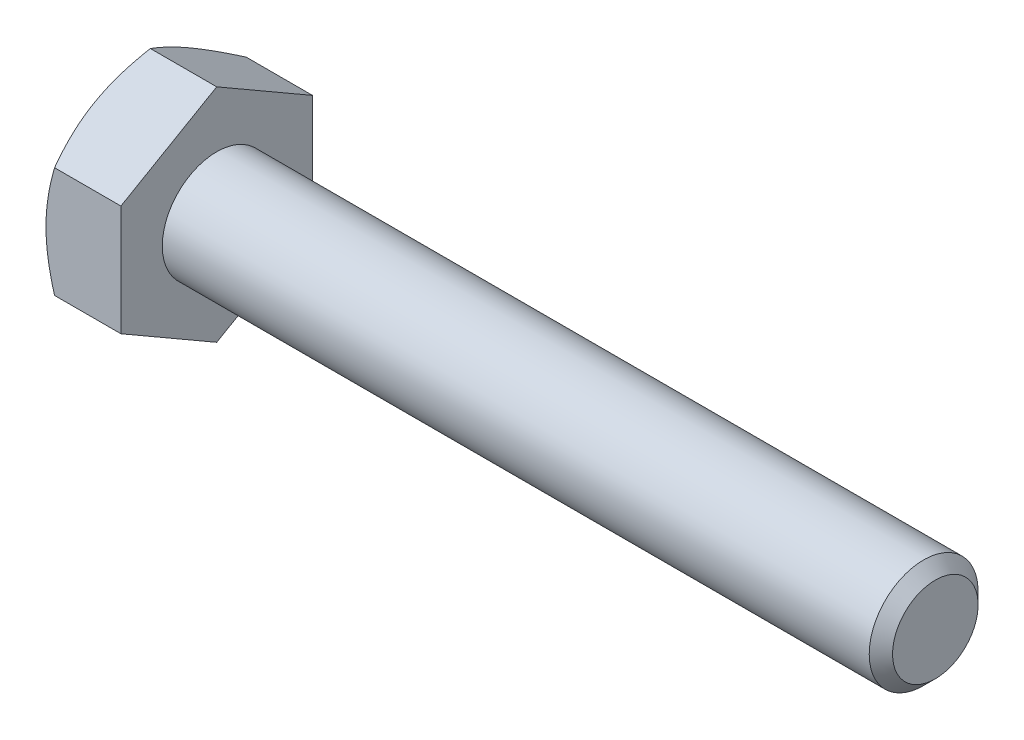
ISO-10303-21;
HEADER;
FILE_DESCRIPTION(('STEP AP214'),'2;1');
FILE_NAME('part.step','',(''),(''),'','','');
FILE_SCHEMA(('AUTOMOTIVE_DESIGN { 1 0 10303 214 1 1 1 1 }'));
ENDSEC;
DATA;
#1=APPLICATION_CONTEXT('core data for automotive mechanical design processes');
#2=APPLICATION_PROTOCOL_DEFINITION('international standard','automotive_design',2000,#1);
#3=PRODUCT_CONTEXT('',#1,'mechanical');
#4=PRODUCT('Part','Part','',(#3));
#5=PRODUCT_RELATED_PRODUCT_CATEGORY('part','',(#4));
#6=PRODUCT_DEFINITION_FORMATION('','',#4);
#7=PRODUCT_DEFINITION_CONTEXT('part definition',#1,'design');
#8=PRODUCT_DEFINITION('design','',#6,#7);
#9=PRODUCT_DEFINITION_SHAPE('','',#8);
#10=(LENGTH_UNIT() NAMED_UNIT(*) SI_UNIT(.MILLI.,.METRE.));
#11=(NAMED_UNIT(*) PLANE_ANGLE_UNIT() SI_UNIT($,.RADIAN.));
#12=(NAMED_UNIT(*) SI_UNIT($,.STERADIAN.) SOLID_ANGLE_UNIT());
#13=UNCERTAINTY_MEASURE_WITH_UNIT(LENGTH_MEASURE(1.E-05),#10,'distance_accuracy_value','');
#14=(GEOMETRIC_REPRESENTATION_CONTEXT(3) GLOBAL_UNCERTAINTY_ASSIGNED_CONTEXT((#13)) GLOBAL_UNIT_ASSIGNED_CONTEXT((#10,
#11,#12)) REPRESENTATION_CONTEXT('',''));
#15=CARTESIAN_POINT('',(0.,0.,0.));
#16=DIRECTION('',(0.,0.,1.));
#17=DIRECTION('',(1.,0.,0.));
#18=AXIS2_PLACEMENT_3D('',#15,#16,#17);
#19=CARTESIAN_POINT('',(-23.1394,-3.22623330423163,5.588));
#20=DIRECTION('',(0.,0.,-1.));
#21=DIRECTION('',(0.,1.,0.));
#22=AXIS2_PLACEMENT_3D('',#19,#20,#21);
#23=PLANE('',#22);
#24=CARTESIAN_POINT('',(-20.3508640773622,-8.79241733299138,5.588));
#25=CARTESIAN_POINT('',(-20.4703027517268,-8.5472336505273,5.588));
#26=CARTESIAN_POINT('',(-20.588632071546,-8.30150045908435,5.588));
#27=CARTESIAN_POINT('',(-20.8224504084549,-7.80864324642656,5.588));
#28=CARTESIAN_POINT('',(-20.9379390012354,-7.56151902413148,5.588));
#29=CARTESIAN_POINT('',(-21.1660083973891,-7.06437461564776,5.588));
#30=CARTESIAN_POINT('',(-21.2785710113902,-6.81434605700835,5.588));
#31=CARTESIAN_POINT('',(-21.4992546696523,-6.31234365850648,5.588));
#32=CARTESIAN_POINT('',(-21.607375915766,-6.06036990766935,5.588));
#33=CARTESIAN_POINT('',(-21.8215614835654,-5.54553577271013,5.588));
#34=CARTESIAN_POINT('',(-21.9274333505784,-5.28259489785967,5.588));
#35=CARTESIAN_POINT('',(-22.1314658980017,-4.75368383874693,5.588));
#36=CARTESIAN_POINT('',(-22.2296257311894,-4.48771332532167,5.588));
#37=CARTESIAN_POINT('',(-22.4157502162977,-3.95277881020881,5.588));
#38=CARTESIAN_POINT('',(-22.5037344448793,-3.68382168566319,5.588));
#39=CARTESIAN_POINT('',(-22.6667676515751,-3.14204851873727,5.588));
#40=CARTESIAN_POINT('',(-22.7418205712384,-2.86923367974657,5.588));
#41=CARTESIAN_POINT('',(-22.8750791448608,-2.32111075665161,5.588));
#42=CARTESIAN_POINT('',(-22.9333787694386,-2.04582588100145,5.588));
#43=CARTESIAN_POINT('',(-23.0299038776532,-1.49166543165662,5.588));
#44=CARTESIAN_POINT('',(-23.0681315338799,-1.2127902499258,5.588));
#45=CARTESIAN_POINT('',(-23.107887509277,-0.794749593743675,5.588));
#46=CARTESIAN_POINT('',(-23.118196723395,-0.656386242395601,5.588));
#47=CARTESIAN_POINT('',(-23.1329533838794,-0.379351954497298,5.588));
#48=CARTESIAN_POINT('',(-23.1374013863473,-0.240681048378031,5.588));
#49=CARTESIAN_POINT('',(-23.1403243387083,0.0367354614835917,5.588));
#50=CARTESIAN_POINT('',(-23.1387987686154,0.175481070677552,5.588));
#51=CARTESIAN_POINT('',(-23.1298142124428,0.452770250709483,5.588));
#52=CARTESIAN_POINT('',(-23.1223554566801,0.591313829180836,5.588));
#53=CARTESIAN_POINT('',(-23.097746692548,0.92047335139034,5.588));
#54=CARTESIAN_POINT('',(-23.0779931711523,1.11089906596391,5.588));
#55=CARTESIAN_POINT('',(-23.0283259496801,1.49041053761113,5.588));
#56=CARTESIAN_POINT('',(-22.998410976359,1.67949612373222,5.588));
#57=CARTESIAN_POINT('',(-22.895004133902,2.24447983670289,5.588));
#58=CARTESIAN_POINT('',(-22.8078662695881,2.61791755072369,5.588));
#59=CARTESIAN_POINT('',(-22.6557971455788,3.17659843479228,5.588));
#60=CARTESIAN_POINT('',(-22.6007937660189,3.3647111535347,5.588));
#61=CARTESIAN_POINT('',(-22.4848363155012,3.73911159951554,5.588));
#62=CARTESIAN_POINT('',(-22.4238821988698,3.9253993127345,5.588));
#63=CARTESIAN_POINT('',(-22.2970209507594,4.29620589688911,5.588));
#64=CARTESIAN_POINT('',(-22.231115224665,4.48072525308721,5.588));
#65=CARTESIAN_POINT('',(-22.095149963917,4.84821737770663,5.588));
#66=CARTESIAN_POINT('',(-22.0250905231941,5.0311901809943,5.588));
#67=CARTESIAN_POINT('',(-21.8316820551199,5.52227507989063,5.588));
#68=CARTESIAN_POINT('',(-21.7050924742431,5.82910969258589,5.588));
#69=CARTESIAN_POINT('',(-21.4445084900243,6.43962999563513,5.588));
#70=CARTESIAN_POINT('',(-21.310513274628,6.7433153363068,5.588));
#71=CARTESIAN_POINT('',(-21.0368653568763,7.34825705807035,5.588));
#72=CARTESIAN_POINT('',(-20.8972105200308,7.64951247039319,5.588));
#73=CARTESIAN_POINT('',(-20.6135924714153,8.24996661998418,5.588));
#74=CARTESIAN_POINT('',(-20.4696294330527,8.54916543943683,5.588));
#75=CARTESIAN_POINT('',(-20.1780992780332,9.14639017233496,5.588));
#76=CARTESIAN_POINT('',(-20.0305267751624,9.44441345115045,5.588));
#77=CARTESIAN_POINT('',(-19.7326919690219,10.0391134428576,5.588));
#78=CARTESIAN_POINT('',(-19.5824296436342,10.3357901446515,5.588));
#79=CARTESIAN_POINT('',(-19.1284944481936,11.2240448705627,5.588));
#80=CARTESIAN_POINT('',(-18.8216080938588,11.8139799206836,5.58799999999999));
#81=CARTESIAN_POINT('',(-18.2347455322786,12.9288265248744,5.58799999999999));
#82=CARTESIAN_POINT('',(-17.9553406904755,13.4540403139454,5.58799999999999));
#83=CARTESIAN_POINT('',(-17.3931547093138,14.5026982062163,5.58799999999999));
#84=CARTESIAN_POINT('',(-17.1103733643985,15.0261421991586,5.58799999999999));
#85=CARTESIAN_POINT('',(-16.5432594230397,16.0699244405322,5.58799999999999));
#86=CARTESIAN_POINT('',(-16.2589351588317,16.5902672232201,5.58799999999999));
#87=CARTESIAN_POINT('',(-15.6883692893914,17.6298478168022,5.58799999999999));
#88=CARTESIAN_POINT('',(-15.4021278364012,18.1490857112192,5.58799999999999));
#89=CARTESIAN_POINT('',(-15.1151882175838,18.6679350744275,5.58799999999999));
#90=B_SPLINE_CURVE_WITH_KNOTS('',3,(#24,#25,#26,#27,#28,#29,#30,#31,#32,#33,#34,#35,#36,#37,#38,
#39,#40,#41,#42,#43,#44,#45,#46,#47,#48,#49,#50,#51,#52,#53,#54,#55,#56,#57,#58,#59,#60,#61,#62,
#63,#64,#65,#66,#67,#68,#69,#70,#71,#72,#73,#74,#75,#76,#77,#78,#79,#80,#81,#82,#83,#84,#85,#86,
#87,#88,#89),.UNSPECIFIED.,.F.,.F.,(4,2,2,2,2,2,2,2,2,2,2,2,2,2,2,2,2,2,2,2,2,2,2,2,2,2,2,2,2,2,
2,2,4),(0.,0.818193813191766,1.63650910394173,2.4590688867784,3.28159124422942,4.13186288142681,
4.98222779685349,5.8309284936448,6.67937004139623,7.52295532640729,8.36644928291514,
8.78258467463132,9.19868058129904,9.61481270897336,10.0309286838311,10.6049497817259,
11.179042831839,12.327790508364,12.9157054618802,13.5036249281509,14.0913781547025,
14.6791180950858,15.6747398029821,16.6704709017855,17.6665810942242,18.6626512464556,
19.6603113831423,20.6579797271896,22.6528736136942,24.4375877996841,26.2224111963068,
28.001275119648,29.7799994214468),.UNSPECIFIED.);
#91=CARTESIAN_POINT('',(-22.6402999708983,-3.22623330423163,5.588));
#92=VERTEX_POINT('',#91);
#93=CARTESIAN_POINT('',(-23.1394,0.,5.588));
#94=VERTEX_POINT('',#93);
#95=EDGE_CURVE('E256',#92,#94,#90,.T.);
#96=ORIENTED_EDGE('',*,*,#95,.F.);
#97=DIRECTION('',(1.,0.,0.));
#98=VECTOR('',#97,1.);
#99=CARTESIAN_POINT('',(-23.1394,-3.22623330423163,5.588));
#100=LINE('',#99,#98);
#101=CARTESIAN_POINT('',(-18.7706,-3.22623330423163,5.588));
#102=VERTEX_POINT('',#101);
#103=EDGE_CURVE('E259',#92,#102,#100,.T.);
#104=ORIENTED_EDGE('',*,*,#103,.T.);
#105=DIRECTION('',(0.,1.,0.));
#106=VECTOR('',#105,1.);
#107=CARTESIAN_POINT('',(-18.7706,-3.22623330423163,5.588));
#108=LINE('',#107,#106);
#109=CARTESIAN_POINT('',(-18.7706,3.22623330423163,5.588));
#110=VERTEX_POINT('',#109);
#111=EDGE_CURVE('E261',#102,#110,#108,.T.);
#112=ORIENTED_EDGE('',*,*,#111,.T.);
#113=DIRECTION('',(1.,0.,0.));
#114=VECTOR('',#113,1.);
#115=CARTESIAN_POINT('',(-23.1394,3.22623330423163,5.588));
#116=LINE('',#115,#114);
#117=CARTESIAN_POINT('',(-22.6402999708983,3.22623330423163,5.588));
#118=VERTEX_POINT('',#117);
#119=EDGE_CURVE('E229',#118,#110,#116,.T.);
#120=ORIENTED_EDGE('',*,*,#119,.F.);
#121=EDGE_CURVE('E113',#94,#118,#90,.T.);
#122=ORIENTED_EDGE('',*,*,#121,.F.);
#123=EDGE_LOOP('',(#96,#104,#112,#120,#122));
#124=FACE_BOUND('',#123,.T.);
#125=ADVANCED_FACE('F37',(#124),#23,.F.);
#126=CARTESIAN_POINT('',(-23.1394,3.22623330423163,5.588));
#127=DIRECTION('',(0.,-0.866025403784439,-0.5));
#128=DIRECTION('',(0.,0.5,-0.866025403784439));
#129=AXIS2_PLACEMENT_3D('',#126,#127,#128);
#130=PLANE('',#129);
#131=CARTESIAN_POINT('',(-22.6402333024421,3.22611783417779,5.5882));
#132=CARTESIAN_POINT('',(-22.6811712302094,3.29703428087773,5.46536911122347));
#133=CARTESIAN_POINT('',(-22.7202512809091,3.36821513862342,5.34208024908159));
#134=CARTESIAN_POINT('',(-22.7941839258956,3.51115492143839,5.0945012828232));
#135=CARTESIAN_POINT('',(-22.8290346965124,3.58291408175004,4.97021077125495));
#136=CARTESIAN_POINT('',(-22.9265590369102,3.79934053377864,4.59534916023953));
#137=CARTESIAN_POINT('',(-22.9820300083912,3.94486214030133,4.34329834414319));
#138=CARTESIAN_POINT('',(-23.0470766884803,4.1626325806799,3.96610887702086));
#139=CARTESIAN_POINT('',(-23.0656066897358,4.2342307260177,3.8420972515681));
#140=CARTESIAN_POINT('',(-23.0966790066241,4.37775054122726,3.59351363973223));
#141=CARTESIAN_POINT('',(-23.109221851303,4.44967218194672,3.46894170384242));
#142=CARTESIAN_POINT('',(-23.1280001966958,4.59364038520367,3.21958146112699));
#143=CARTESIAN_POINT('',(-23.1342428557043,4.6656867125864,3.09479356160135));
#144=CARTESIAN_POINT('',(-23.1402936664508,4.80984195419064,2.84510935896543));
#145=CARTESIAN_POINT('',(-23.1401020169506,4.88195086641004,2.72021305932292));
#146=CARTESIAN_POINT('',(-23.1307324639545,5.07950845790681,2.37803327342957));
#147=CARTESIAN_POINT('',(-23.1150016610822,5.20489247600728,2.16086178362241));
#148=CARTESIAN_POINT('',(-23.0651180029902,5.45482771715137,1.72796124735887));
#149=CARTESIAN_POINT('',(-23.0309480959494,5.57937806113722,1.51223372347521));
#150=CARTESIAN_POINT('',(-22.9455327931439,5.82981634400382,1.07846189338994));
#151=CARTESIAN_POINT('',(-22.8939254824815,5.95567268044839,0.860472324213458));
#152=CARTESIAN_POINT('',(-22.7767975361716,6.20550842261546,0.427744125233421));
#153=CARTESIAN_POINT('',(-22.7113044154324,6.32949102819244,0.21299995311933));
#154=CARTESIAN_POINT('',(-22.6402333024421,6.4525820785171,-0.000200000000000311));
#155=B_SPLINE_CURVE_WITH_KNOTS('',3,(#131,#132,#133,#134,#135,#136,#137,#138,#139,#140,#141,
#142,#143,#144,#145,#146,#147,#148,#149,#150,#151,#152,#153,#154),.UNSPECIFIED.,.F.,.F.,(4,2,2,
2,2,2,2,2,2,2,2,4),(0.,0.442832959739192,0.885856196073715,1.77374363000408,2.20681321259302,
2.63984452054292,3.07238326088174,3.50490863971089,4.25790134074134,5.01159157867975,
5.78199820717711,6.55089229882471),.UNSPECIFIED.);
#156=CARTESIAN_POINT('',(-23.1394,4.83934995634744,2.794));
#157=VERTEX_POINT('',#156);
#158=EDGE_CURVE('E109',#118,#157,#155,.T.);
#159=ORIENTED_EDGE('',*,*,#158,.F.);
#160=ORIENTED_EDGE('',*,*,#119,.T.);
#161=DIRECTION('',(0.,0.5,-0.866025403784439));
#162=VECTOR('',#161,1.);
#163=CARTESIAN_POINT('',(-18.7706,3.22623330423163,5.588));
#164=LINE('',#163,#162);
#165=CARTESIAN_POINT('',(-18.7706,6.45246660846326,0.));
#166=VERTEX_POINT('',#165);
#167=EDGE_CURVE('E279',#110,#166,#164,.T.);
#168=ORIENTED_EDGE('',*,*,#167,.T.);
#169=DIRECTION('',(1.,0.,0.));
#170=VECTOR('',#169,1.);
#171=CARTESIAN_POINT('',(-23.1394,6.45246660846326,0.));
#172=LINE('',#171,#170);
#173=CARTESIAN_POINT('',(-22.6402999708983,6.45246660846326,0.));
#174=VERTEX_POINT('',#173);
#175=EDGE_CURVE('E132',#174,#166,#172,.T.);
#176=ORIENTED_EDGE('',*,*,#175,.F.);
#177=EDGE_CURVE('E117',#157,#174,#155,.T.);
#178=ORIENTED_EDGE('',*,*,#177,.F.);
#179=EDGE_LOOP('',(#159,#160,#168,#176,#178));
#180=FACE_BOUND('',#179,.T.);
#181=ADVANCED_FACE('F130',(#180),#130,.F.);
#182=CARTESIAN_POINT('',(-23.1394,6.45246660846326,0.));
#183=DIRECTION('',(0.,-0.866025403784439,0.5));
#184=DIRECTION('',(0.,-0.5,-0.866025403784439));
#185=AXIS2_PLACEMENT_3D('',#182,#183,#184);
#186=PLANE('',#185);
#187=CARTESIAN_POINT('',(-22.6402333024421,6.4525820785171,0.000199999999999124));
#188=CARTESIAN_POINT('',(-22.6811712302094,6.38166563181716,-0.122630888776533));
#189=CARTESIAN_POINT('',(-22.7202512809091,6.31048477407147,-0.245919750918404));
#190=CARTESIAN_POINT('',(-22.7941839258956,6.1675449912565,-0.493498717176801));
#191=CARTESIAN_POINT('',(-22.8290346965124,6.09578583094485,-0.617789228745046));
#192=CARTESIAN_POINT('',(-22.9265590369102,5.87935937891625,-0.992650839760466));
#193=CARTESIAN_POINT('',(-22.9820300083912,5.73383777239356,-1.24470165585681));
#194=CARTESIAN_POINT('',(-23.0470766884803,5.51606733201499,-1.62189112297913));
#195=CARTESIAN_POINT('',(-23.0656066897358,5.44446918667719,-1.7459027484319));
#196=CARTESIAN_POINT('',(-23.0966790066241,5.30094937146763,-1.99448636026776));
#197=CARTESIAN_POINT('',(-23.109221851303,5.22902773074817,-2.11905829615757));
#198=CARTESIAN_POINT('',(-23.1280001966958,5.08505952749122,-2.36841853887301));
#199=CARTESIAN_POINT('',(-23.1342428557043,5.01301320010849,-2.49320643839865));
#200=CARTESIAN_POINT('',(-23.1402936664508,4.86885795850425,-2.74289064103456));
#201=CARTESIAN_POINT('',(-23.1401020169506,4.79674904628485,-2.86778694067708));
#202=CARTESIAN_POINT('',(-23.1307324639545,4.59919145478808,-3.20996672657043));
#203=CARTESIAN_POINT('',(-23.1150016610822,4.47380743668761,-3.42713821637758));
#204=CARTESIAN_POINT('',(-23.0651180029902,4.22387219554352,-3.86003875264113));
#205=CARTESIAN_POINT('',(-23.0309480959494,4.09932185155767,-4.07576627652479));
#206=CARTESIAN_POINT('',(-22.9455327931439,3.84888356869107,-4.50953810661006));
#207=CARTESIAN_POINT('',(-22.8939254824815,3.72302723224649,-4.72752767578654));
#208=CARTESIAN_POINT('',(-22.7767975361716,3.47319149007943,-5.16025587476658));
#209=CARTESIAN_POINT('',(-22.7113044154324,3.34920888450245,-5.37500004688067));
#210=CARTESIAN_POINT('',(-22.6402333024421,3.22611783417779,-5.5882));
#211=B_SPLINE_CURVE_WITH_KNOTS('',3,(#187,#188,#189,#190,#191,#192,#193,#194,#195,#196,#197,
#198,#199,#200,#201,#202,#203,#204,#205,#206,#207,#208,#209,#210),.UNSPECIFIED.,.F.,.F.,(4,2,2,
2,2,2,2,2,2,2,2,4),(0.,0.442832959739192,0.885856196073713,1.77374363000408,2.20681321259302,
2.63984452054292,3.07238326088174,3.50490863971089,4.25790134074134,5.01159157867974,
5.78199820717711,6.55089229882472),.UNSPECIFIED.);
#212=CARTESIAN_POINT('',(-23.1394,4.83934995634744,-2.794));
#213=VERTEX_POINT('',#212);
#214=EDGE_CURVE('E122',#174,#213,#211,.T.);
#215=ORIENTED_EDGE('',*,*,#214,.F.);
#216=ORIENTED_EDGE('',*,*,#175,.T.);
#217=DIRECTION('',(0.,-0.5,-0.866025403784439));
#218=VECTOR('',#217,1.);
#219=CARTESIAN_POINT('',(-18.7706,6.45246660846326,0.));
#220=LINE('',#219,#218);
#221=CARTESIAN_POINT('',(-18.7706,3.22623330423163,-5.588));
#222=VERTEX_POINT('',#221);
#223=EDGE_CURVE('E276',#166,#222,#220,.T.);
#224=ORIENTED_EDGE('',*,*,#223,.T.);
#225=DIRECTION('',(1.,0.,0.));
#226=VECTOR('',#225,1.);
#227=CARTESIAN_POINT('',(-23.1394,3.22623330423163,-5.588));
#228=LINE('',#227,#226);
#229=CARTESIAN_POINT('',(-22.6402999708983,3.22623330423163,-5.588));
#230=VERTEX_POINT('',#229);
#231=EDGE_CURVE('E273',#230,#222,#228,.T.);
#232=ORIENTED_EDGE('',*,*,#231,.F.);
#233=EDGE_CURVE('E133',#213,#230,#211,.T.);
#234=ORIENTED_EDGE('',*,*,#233,.F.);
#235=EDGE_LOOP('',(#215,#216,#224,#232,#234));
#236=FACE_BOUND('',#235,.T.);
#237=ADVANCED_FACE('F193',(#236),#186,.F.);
#238=CARTESIAN_POINT('',(-23.1394,3.22623330423163,-5.588));
#239=DIRECTION('',(0.,0.,1.));
#240=DIRECTION('',(0.,-1.,0.));
#241=AXIS2_PLACEMENT_3D('',#238,#239,#240);
#242=PLANE('',#241);
#243=CARTESIAN_POINT('',(-20.3508640796963,-8.79241732820122,-5.588));
#244=CARTESIAN_POINT('',(-20.4703027539636,-8.54723364589842,-5.588));
#245=CARTESIAN_POINT('',(-20.5886320736856,-8.30150045461686,-5.588));
#246=CARTESIAN_POINT('',(-20.8224504104005,-7.80864324228234,-5.588));
#247=CARTESIAN_POINT('',(-20.9379390030842,-7.56151902014914,-5.588));
#248=CARTESIAN_POINT('',(-21.1660083990444,-7.06437461199162,-5.588));
#249=CARTESIAN_POINT('',(-21.2785710129487,-6.81434605351653,-5.588));
#250=CARTESIAN_POINT('',(-21.4992546710189,-6.31234365534442,-5.588));
#251=CARTESIAN_POINT('',(-21.6073759170373,-6.06036990467272,-5.588));
#252=CARTESIAN_POINT('',(-21.8215614846435,-5.54553577005742,-5.588));
#253=CARTESIAN_POINT('',(-21.9274333515586,-5.28259489538557,-5.588));
#254=CARTESIAN_POINT('',(-22.1314658987914,-4.7536838366329,-5.588));
#255=CARTESIAN_POINT('',(-22.2296257318864,-4.4877133233891,-5.588));
#256=CARTESIAN_POINT('',(-22.4157502168181,-3.95277880864251,-5.588));
#257=CARTESIAN_POINT('',(-22.5037344453158,-3.68382168428168,-5.588));
#258=CARTESIAN_POINT('',(-22.6667676518573,-3.14204851773037,-5.588));
#259=CARTESIAN_POINT('',(-22.7418205714503,-2.86923367892948,-5.588));
#260=CARTESIAN_POINT('',(-22.8750791449305,-2.3211107563107,-5.588));
#261=CARTESIAN_POINT('',(-22.9333787694419,-2.04582588094822,-5.588));
#262=CARTESIAN_POINT('',(-23.029903877567,-1.49166543218591,-5.588));
#263=CARTESIAN_POINT('',(-23.0681315337705,-1.21279025074994,-5.588));
#264=CARTESIAN_POINT('',(-23.1078875091721,-0.794749595008062,-5.588));
#265=CARTESIAN_POINT('',(-23.118196723298,-0.656386243804605,-5.588));
#266=CARTESIAN_POINT('',(-23.1329533838109,-0.379351956195274,-5.588));
#267=CARTESIAN_POINT('',(-23.1374013862995,-0.240681050220362,-5.588));
#268=CARTESIAN_POINT('',(-23.1403243387143,0.0367354593535713,-5.588));
#269=CARTESIAN_POINT('',(-23.1387987686546,0.175481068404197,-5.588));
#270=CARTESIAN_POINT('',(-23.1298142125601,0.452770248151341,-5.588));
#271=CARTESIAN_POINT('',(-23.1223554568424,0.591313826481243,-5.588));
#272=CARTESIAN_POINT('',(-23.0977466928206,0.920473348473753,-5.588));
#273=CARTESIAN_POINT('',(-23.0779931714883,1.1108990629724,-5.588));
#274=CARTESIAN_POINT('',(-23.0283259501463,1.49041053447319,-5.588));
#275=CARTESIAN_POINT('',(-22.998410976892,1.67949612052278,-5.588));
#276=CARTESIAN_POINT('',(-22.8950041346367,2.24447983328292,-5.588));
#277=CARTESIAN_POINT('',(-22.8078662704591,2.61791754716897,-5.588));
#278=CARTESIAN_POINT('',(-22.6557971466507,3.17659843103602,-5.588));
#279=CARTESIAN_POINT('',(-22.6007937671583,3.3647111497098,-5.588));
#280=CARTESIAN_POINT('',(-22.4848363167733,3.73911159555414,-5.588));
#281=CARTESIAN_POINT('',(-22.4238822002073,3.92539930870524,-5.588));
#282=CARTESIAN_POINT('',(-22.2970209522252,4.29620589272466,-5.588));
#283=CARTESIAN_POINT('',(-22.2311152261937,4.48072524885541,-5.588));
#284=CARTESIAN_POINT('',(-22.0951499655694,4.84821737334015,-5.588));
#285=CARTESIAN_POINT('',(-22.0250905249072,5.03119017656047,-5.588));
#286=CARTESIAN_POINT('',(-21.8316820569373,5.52227507541866,-5.588));
#287=CARTESIAN_POINT('',(-21.7050924760977,5.82910968814113,-5.588));
#288=CARTESIAN_POINT('',(-21.4445084919422,6.4396299912413,-5.588));
#289=CARTESIAN_POINT('',(-21.3105132765723,6.74331533193668,-5.588));
#290=CARTESIAN_POINT('',(-21.0368653588654,7.34825705374511,-5.588));
#291=CARTESIAN_POINT('',(-20.8972105220385,7.64951246608914,-5.588));
#292=CARTESIAN_POINT('',(-20.6135924734546,8.2499666157202,-5.588));
#293=CARTESIAN_POINT('',(-20.4696294351051,8.54916543519174,-5.588));
#294=CARTESIAN_POINT('',(-20.1780992801071,9.14639016812708,-5.588));
#295=CARTESIAN_POINT('',(-20.0305267772448,9.44441344696089,-5.588));
#296=CARTESIAN_POINT('',(-19.7326919711181,10.0391134387033,-5.588));
#297=CARTESIAN_POINT('',(-19.5824296457359,10.3357901405142,-5.588));
#298=CARTESIAN_POINT('',(-19.1284944503084,11.2240448664743,-5.588));
#299=CARTESIAN_POINT('',(-18.821608095978,11.8139799166255,-5.588));
#300=CARTESIAN_POINT('',(-18.2347455344141,12.9288265208464,-5.588));
#301=CARTESIAN_POINT('',(-17.9553406926236,13.4540403099175,-5.588));
#302=CARTESIAN_POINT('',(-17.3931547114848,14.5026982021875,-5.588));
#303=CARTESIAN_POINT('',(-17.1103733665796,15.0261421951287,-5.588));
#304=CARTESIAN_POINT('',(-16.5432594252416,16.0699244364951,-5.588));
#305=CARTESIAN_POINT('',(-16.2589351610443,16.5902672191768,-5.588));
#306=CARTESIAN_POINT('',(-15.6883692916242,17.6298478127458,-5.588));
#307=CARTESIAN_POINT('',(-15.4021278386435,18.1490857071557,-5.588));
#308=CARTESIAN_POINT('',(-15.1151882198352,18.6679350703569,-5.58800000000001));
#309=B_SPLINE_CURVE_WITH_KNOTS('',3,(#243,#244,#245,#246,#247,#248,#249,#250,#251,#252,#253,
#254,#255,#256,#257,#258,#259,#260,#261,#262,#263,#264,#265,#266,#267,#268,#269,#270,#271,#272,
#273,#274,#275,#276,#277,#278,#279,#280,#281,#282,#283,#284,#285,#286,#287,#288,#289,#290,#291,
#292,#293,#294,#295,#296,#297,#298,#299,#300,#301,#302,#303,#304,#305,#306,#307,#308),
.UNSPECIFIED.,.F.,.F.,(4,2,2,2,2,2,2,2,2,2,2,2,2,2,2,2,2,2,2,2,2,2,2,2,2,2,2,2,2,2,2,2,4),(0.,
0.818193812628983,1.63650910281609,2.45906888508403,3.28159124196637,4.13186287855712,
4.98222779337696,5.83092848956339,6.67937003671041,7.52295532083765,8.36644927646298,
8.78258466774862,9.19868057398591,9.61481270122954,10.0309286756566,10.6049497733084,
11.1790428231783,12.3277904992162,12.9157054524777,13.5036249184939,14.0913781447917,
14.6791180849211,15.6747397928501,16.6704708916865,17.6665810841593,18.6626512364247,
19.6603113731493,20.6579797172346,22.6528736038138,24.4375877897862,26.2224111863916,
28.0012751097012,29.779999411468),.UNSPECIFIED.);
#310=CARTESIAN_POINT('',(-23.1394,0.,-5.588));
#311=VERTEX_POINT('',#310);
#312=EDGE_CURVE('E187',#230,#311,#309,.F.);
#313=ORIENTED_EDGE('',*,*,#312,.F.);
#314=ORIENTED_EDGE('',*,*,#231,.T.);
#315=DIRECTION('',(0.,-1.,0.));
#316=VECTOR('',#315,1.);
#317=CARTESIAN_POINT('',(-18.7706,3.22623330423163,-5.588));
#318=LINE('',#317,#316);
#319=CARTESIAN_POINT('',(-18.7706,-3.22623330423163,-5.588));
#320=VERTEX_POINT('',#319);
#321=EDGE_CURVE('E283',#222,#320,#318,.T.);
#322=ORIENTED_EDGE('',*,*,#321,.T.);
#323=DIRECTION('',(1.,0.,0.));
#324=VECTOR('',#323,1.);
#325=CARTESIAN_POINT('',(-23.1394,-3.22623330423163,-5.588));
#326=LINE('',#325,#324);
#327=CARTESIAN_POINT('',(-22.6402999708983,-3.22623330423163,-5.588));
#328=VERTEX_POINT('',#327);
#329=EDGE_CURVE('E244',#328,#320,#326,.T.);
#330=ORIENTED_EDGE('',*,*,#329,.F.);
#331=EDGE_CURVE('E181',#311,#328,#309,.F.);
#332=ORIENTED_EDGE('',*,*,#331,.F.);
#333=EDGE_LOOP('',(#313,#314,#322,#330,#332));
#334=FACE_BOUND('',#333,.T.);
#335=ADVANCED_FACE('F189',(#334),#242,.F.);
#336=CARTESIAN_POINT('',(-23.1394,-3.22623330423163,-5.588));
#337=DIRECTION('',(0.,0.866025403784439,0.5));
#338=DIRECTION('',(0.,-0.5,0.866025403784439));
#339=AXIS2_PLACEMENT_3D('',#336,#337,#338);
#340=PLANE('',#339);
#341=CARTESIAN_POINT('',(-22.6402333024421,-3.22611783417779,-5.5882));
#342=CARTESIAN_POINT('',(-22.6811712302094,-3.29703428087772,-5.46536911122347));
#343=CARTESIAN_POINT('',(-22.7202512809091,-3.36821513862342,-5.3420802490816));
#344=CARTESIAN_POINT('',(-22.7941839258956,-3.51115492143839,-5.0945012828232));
#345=CARTESIAN_POINT('',(-22.8290346965124,-3.58291408175003,-4.97021077125495));
#346=CARTESIAN_POINT('',(-22.9265590369102,-3.79934053377864,-4.59534916023953));
#347=CARTESIAN_POINT('',(-22.9820300083912,-3.94486214030133,-4.34329834414319));
#348=CARTESIAN_POINT('',(-23.0470766884803,-4.1626325806799,-3.96610887702087));
#349=CARTESIAN_POINT('',(-23.0656066897358,-4.23423072601769,-3.8420972515681));
#350=CARTESIAN_POINT('',(-23.0966790066241,-4.37775054122726,-3.59351363973223));
#351=CARTESIAN_POINT('',(-23.109221851303,-4.44967218194671,-3.46894170384243));
#352=CARTESIAN_POINT('',(-23.1280001966958,-4.59364038520366,-3.21958146112699));
#353=CARTESIAN_POINT('',(-23.1342428557043,-4.6656867125864,-3.09479356160135));
#354=CARTESIAN_POINT('',(-23.1402936664508,-4.80984195419064,-2.84510935896544));
#355=CARTESIAN_POINT('',(-23.1401020169506,-4.88195086641004,-2.72021305932292));
#356=CARTESIAN_POINT('',(-23.1307324639545,-5.07950845790681,-2.37803327342957));
#357=CARTESIAN_POINT('',(-23.1150016610822,-5.20489247600728,-2.16086178362242));
#358=CARTESIAN_POINT('',(-23.0651180029902,-5.45482771715137,-1.72796124735887));
#359=CARTESIAN_POINT('',(-23.0309480959494,-5.57937806113721,-1.51223372347521));
#360=CARTESIAN_POINT('',(-22.945532793144,-5.82981634400382,-1.07846189338994));
#361=CARTESIAN_POINT('',(-22.8939254824815,-5.95567268044839,-0.86047232421346));
#362=CARTESIAN_POINT('',(-22.7767975361716,-6.20550842261546,-0.427744125233424));
#363=CARTESIAN_POINT('',(-22.7113044154324,-6.32949102819243,-0.212999953119332));
#364=CARTESIAN_POINT('',(-22.6402333024421,-6.45258207851709,0.000199999999999051));
#365=B_SPLINE_CURVE_WITH_KNOTS('',3,(#341,#342,#343,#344,#345,#346,#347,#348,#349,#350,#351,
#352,#353,#354,#355,#356,#357,#358,#359,#360,#361,#362,#363,#364),.UNSPECIFIED.,.F.,.F.,(4,2,2,
2,2,2,2,2,2,2,2,4),(0.,0.442832959739192,0.885856196073716,1.77374363000408,2.20681321259303,
2.63984452054292,3.07238326088174,3.50490863971089,4.25790134074134,5.01159157867975,
5.78199820717712,6.55089229882472),.UNSPECIFIED.);
#366=CARTESIAN_POINT('',(-23.1394,-4.83934995634744,-2.794));
#367=VERTEX_POINT('',#366);
#368=EDGE_CURVE('E188',#328,#367,#365,.T.);
#369=ORIENTED_EDGE('',*,*,#368,.F.);
#370=ORIENTED_EDGE('',*,*,#329,.T.);
#371=DIRECTION('',(0.,-0.5,0.866025403784439));
#372=VECTOR('',#371,1.);
#373=CARTESIAN_POINT('',(-18.7706,-3.22623330423163,-5.588));
#374=LINE('',#373,#372);
#375=CARTESIAN_POINT('',(-18.7706,-6.45246660846326,0.));
#376=VERTEX_POINT('',#375);
#377=EDGE_CURVE('E268',#320,#376,#374,.T.);
#378=ORIENTED_EDGE('',*,*,#377,.T.);
#379=DIRECTION('',(1.,0.,0.));
#380=VECTOR('',#379,1.);
#381=CARTESIAN_POINT('',(-23.1394,-6.45246660846326,0.));
#382=LINE('',#381,#380);
#383=CARTESIAN_POINT('',(-22.6402999708983,-6.45246660846326,0.));
#384=VERTEX_POINT('',#383);
#385=EDGE_CURVE('E265',#384,#376,#382,.T.);
#386=ORIENTED_EDGE('',*,*,#385,.F.);
#387=EDGE_CURVE('E175',#367,#384,#365,.T.);
#388=ORIENTED_EDGE('',*,*,#387,.F.);
#389=EDGE_LOOP('',(#369,#370,#378,#386,#388));
#390=FACE_BOUND('',#389,.T.);
#391=ADVANCED_FACE('F192',(#390),#340,.F.);
#392=CARTESIAN_POINT('',(-23.1394,-6.45246660846326,0.));
#393=DIRECTION('',(0.,0.866025403784439,-0.5));
#394=DIRECTION('',(0.,0.5,0.866025403784439));
#395=AXIS2_PLACEMENT_3D('',#392,#393,#394);
#396=PLANE('',#395);
#397=CARTESIAN_POINT('',(-22.6402333024421,-6.4525820785171,-0.000200000000000763));
#398=CARTESIAN_POINT('',(-22.6811712302094,-6.38166563181716,0.122630888776531));
#399=CARTESIAN_POINT('',(-22.7202512809091,-6.31048477407147,0.245919750918403));
#400=CARTESIAN_POINT('',(-22.7941839258956,-6.1675449912565,0.4934987171768));
#401=CARTESIAN_POINT('',(-22.8290346965124,-6.09578583094485,0.617789228745045));
#402=CARTESIAN_POINT('',(-22.9265590369102,-5.87935937891625,0.992650839760465));
#403=CARTESIAN_POINT('',(-22.9820300083912,-5.73383777239356,1.24470165585681));
#404=CARTESIAN_POINT('',(-23.0470766884803,-5.51606733201499,1.62189112297913));
#405=CARTESIAN_POINT('',(-23.0656066897358,-5.44446918667719,1.7459027484319));
#406=CARTESIAN_POINT('',(-23.0966790066241,-5.30094937146763,1.99448636026776));
#407=CARTESIAN_POINT('',(-23.109221851303,-5.22902773074817,2.11905829615757));
#408=CARTESIAN_POINT('',(-23.1280001966958,-5.08505952749122,2.36841853887301));
#409=CARTESIAN_POINT('',(-23.1342428557043,-5.01301320010849,2.49320643839865));
#410=CARTESIAN_POINT('',(-23.1402936664508,-4.86885795850425,2.74289064103456));
#411=CARTESIAN_POINT('',(-23.1401020169506,-4.79674904628485,2.86778694067708));
#412=CARTESIAN_POINT('',(-23.1307324639545,-4.59919145478808,3.20996672657042));
#413=CARTESIAN_POINT('',(-23.1150016610822,-4.47380743668761,3.42713821637758));
#414=CARTESIAN_POINT('',(-23.0651180029902,-4.22387219554352,3.86003875264113));
#415=CARTESIAN_POINT('',(-23.0309480959494,-4.09932185155767,4.07576627652479));
#416=CARTESIAN_POINT('',(-22.945532793144,-3.84888356869106,4.50953810661006));
#417=CARTESIAN_POINT('',(-22.8939254824815,-3.72302723224649,4.72752767578654));
#418=CARTESIAN_POINT('',(-22.7767975361716,-3.47319149007943,5.16025587476658));
#419=CARTESIAN_POINT('',(-22.7113044154324,-3.34920888450245,5.37500004688067));
#420=CARTESIAN_POINT('',(-22.6402333024421,-3.22611783417779,5.5882));
#421=B_SPLINE_CURVE_WITH_KNOTS('',3,(#397,#398,#399,#400,#401,#402,#403,#404,#405,#406,#407,
#408,#409,#410,#411,#412,#413,#414,#415,#416,#417,#418,#419,#420),.UNSPECIFIED.,.F.,.F.,(4,2,2,
2,2,2,2,2,2,2,2,4),(0.,0.442832959739192,0.885856196073715,1.77374363000408,2.20681321259303,
2.63984452054292,3.07238326088174,3.50490863971089,4.25790134074134,5.01159157867975,
5.78199820717712,6.55089229882472),.UNSPECIFIED.);
#422=CARTESIAN_POINT('',(-23.1394,-4.83934995634744,2.794));
#423=VERTEX_POINT('',#422);
#424=EDGE_CURVE('E251',#384,#423,#421,.T.);
#425=ORIENTED_EDGE('',*,*,#424,.F.);
#426=ORIENTED_EDGE('',*,*,#385,.T.);
#427=DIRECTION('',(0.,0.5,0.866025403784439));
#428=VECTOR('',#427,1.);
#429=CARTESIAN_POINT('',(-18.7706,-6.45246660846326,0.));
#430=LINE('',#429,#428);
#431=EDGE_CURVE('E263',#376,#102,#430,.T.);
#432=ORIENTED_EDGE('',*,*,#431,.T.);
#433=ORIENTED_EDGE('',*,*,#103,.F.);
#434=EDGE_CURVE('E127',#423,#92,#421,.T.);
#435=ORIENTED_EDGE('',*,*,#434,.F.);
#436=EDGE_LOOP('',(#425,#426,#432,#433,#435));
#437=FACE_BOUND('',#436,.T.);
#438=ADVANCED_FACE('F214',(#437),#396,.F.);
#439=CARTESIAN_POINT('',(-18.7706,0.,0.));
#440=DIRECTION('',(1.,0.,0.));
#441=DIRECTION('',(0.,0.,-1.));
#442=AXIS2_PLACEMENT_3D('',#439,#440,#441);
#443=CYLINDRICAL_SURFACE('',#442,3.175);
#444=CARTESIAN_POINT('',(22.4590428571429,0.,0.));
#445=DIRECTION('',(1.,0.,0.));
#446=DIRECTION('',(0.,0.,-1.));
#447=AXIS2_PLACEMENT_3D('',#444,#445,#446);
#448=CIRCLE('',#447,3.175);
#449=CARTESIAN_POINT('',(22.4590428571429,0.,3.175));
#450=VERTEX_POINT('',#449);
#451=EDGE_CURVE('E223',#450,#450,#448,.F.);
#452=ORIENTED_EDGE('',*,*,#451,.T.);
#453=EDGE_LOOP('',(#452));
#454=FACE_BOUND('',#453,.T.);
#455=CARTESIAN_POINT('',(-18.7706,0.,0.));
#456=DIRECTION('',(-1.,0.,0.));
#457=DIRECTION('',(0.,0.,1.));
#458=AXIS2_PLACEMENT_3D('',#455,#456,#457);
#459=CIRCLE('',#458,3.175);
#460=CARTESIAN_POINT('',(-18.7706,0.,3.175));
#461=VERTEX_POINT('',#460);
#462=EDGE_CURVE('E226',#461,#461,#459,.F.);
#463=ORIENTED_EDGE('',*,*,#462,.T.);
#464=EDGE_LOOP('',(#463));
#465=FACE_BOUND('',#464,.T.);
#466=ADVANCED_FACE('F211',(#454,#465),#443,.T.);
#467=CARTESIAN_POINT('',(23.1394,0.,0.));
#468=DIRECTION('',(1.,0.,0.));
#469=DIRECTION('',(0.,0.,-1.));
#470=AXIS2_PLACEMENT_3D('',#467,#468,#469);
#471=PLANE('',#470);
#472=CARTESIAN_POINT('',(23.1394,0.,0.));
#473=DIRECTION('',(1.,0.,0.));
#474=DIRECTION('',(0.,0.,-1.));
#475=AXIS2_PLACEMENT_3D('',#472,#473,#474);
#476=CIRCLE('',#475,2.49464285714286);
#477=CARTESIAN_POINT('',(23.1394,0.,2.49464285714286));
#478=VERTEX_POINT('',#477);
#479=EDGE_CURVE('E228',#478,#478,#476,.T.);
#480=ORIENTED_EDGE('',*,*,#479,.T.);
#481=EDGE_LOOP('',(#480));
#482=FACE_BOUND('',#481,.T.);
#483=ADVANCED_FACE('F209',(#482),#471,.T.);
#484=CARTESIAN_POINT('',(23.1394,0.,0.));
#485=DIRECTION('',(-1.,0.,0.));
#486=DIRECTION('',(0.,0.,1.));
#487=AXIS2_PLACEMENT_3D('',#484,#485,#486);
#488=CONICAL_SURFACE('',#487,2.49464285714286,0.785398163397445);
#489=CARTESIAN_POINT('',(22.4590428571429,0.,3.175));
#490=CARTESIAN_POINT('',(22.4661299107143,0.,3.16791294642857));
#491=CARTESIAN_POINT('',(22.4732169642857,0.,3.16082589285714));
#492=CARTESIAN_POINT('',(22.4873910714286,0.,3.14665178571429));
#493=CARTESIAN_POINT('',(22.494478125,0.,3.13956473214286));
#494=CARTESIAN_POINT('',(22.5086522321429,0.,3.125390625));
#495=CARTESIAN_POINT('',(22.5157392857143,0.,3.11830357142857));
#496=CARTESIAN_POINT('',(22.5299133928571,0.,3.10412946428572));
#497=CARTESIAN_POINT('',(22.5370004464286,0.,3.09704241071429));
#498=CARTESIAN_POINT('',(22.5511745535714,0.,3.08286830357143));
#499=CARTESIAN_POINT('',(22.5582616071429,0.,3.07578125));
#500=CARTESIAN_POINT('',(22.5724357142857,0.,3.06160714285715));
#501=CARTESIAN_POINT('',(22.5795227678571,0.,3.05452008928572));
#502=CARTESIAN_POINT('',(22.593696875,0.,3.04034598214286));
#503=CARTESIAN_POINT('',(22.6007839285714,0.,3.03325892857143));
#504=CARTESIAN_POINT('',(22.6149580357143,0.,3.01908482142857));
#505=CARTESIAN_POINT('',(22.6220450892857,0.,3.01199776785715));
#506=CARTESIAN_POINT('',(22.6362191964286,0.,2.99782366071429));
#507=CARTESIAN_POINT('',(22.64330625,0.,2.99073660714286));
#508=CARTESIAN_POINT('',(22.6574803571429,0.,2.9765625));
#509=CARTESIAN_POINT('',(22.6645674107143,0.,2.96947544642857));
#510=CARTESIAN_POINT('',(22.6787415178571,0.,2.95530133928572));
#511=CARTESIAN_POINT('',(22.6858285714286,0.,2.94821428571429));
#512=CARTESIAN_POINT('',(22.7000026785714,0.,2.93404017857143));
#513=CARTESIAN_POINT('',(22.7070897321429,0.,2.926953125));
#514=CARTESIAN_POINT('',(22.7212638392857,0.,2.91277901785715));
#515=CARTESIAN_POINT('',(22.7283508928571,0.,2.90569196428572));
#516=CARTESIAN_POINT('',(22.742525,0.,2.89151785714286));
#517=CARTESIAN_POINT('',(22.7496120535714,0.,2.88443080357143));
#518=CARTESIAN_POINT('',(22.7637861607143,0.,2.87025669642858));
#519=CARTESIAN_POINT('',(22.7708732142857,0.,2.86316964285715));
#520=CARTESIAN_POINT('',(22.7850473214286,0.,2.84899553571429));
#521=CARTESIAN_POINT('',(22.792134375,0.,2.84190848214286));
#522=CARTESIAN_POINT('',(22.8063084821428,0.,2.827734375));
#523=CARTESIAN_POINT('',(22.8133955357143,0.,2.82064732142858));
#524=CARTESIAN_POINT('',(22.8275696428571,0.,2.80647321428572));
#525=CARTESIAN_POINT('',(22.8346566964286,0.,2.79938616071429));
#526=CARTESIAN_POINT('',(22.8488308035714,0.,2.78521205357143));
#527=CARTESIAN_POINT('',(22.8559178571429,0.,2.778125));
#528=CARTESIAN_POINT('',(22.8700919642857,0.,2.76395089285715));
#529=CARTESIAN_POINT('',(22.8771790178571,0.,2.75686383928572));
#530=CARTESIAN_POINT('',(22.891353125,0.,2.74268973214286));
#531=CARTESIAN_POINT('',(22.8984401785714,0.,2.73560267857143));
#532=CARTESIAN_POINT('',(22.9126142857143,0.,2.72142857142858));
#533=CARTESIAN_POINT('',(22.9197013392857,0.,2.71434151785715));
#534=CARTESIAN_POINT('',(22.9338754464286,0.,2.70016741071429));
#535=CARTESIAN_POINT('',(22.9409625,0.,2.69308035714286));
#536=CARTESIAN_POINT('',(22.9551366071429,0.,2.67890625000001));
#537=CARTESIAN_POINT('',(22.9622236607143,0.,2.67181919642858));
#538=CARTESIAN_POINT('',(22.9763977678571,0.,2.65764508928572));
#539=CARTESIAN_POINT('',(22.9834848214286,0.,2.65055803571429));
#540=CARTESIAN_POINT('',(22.9976589285714,0.,2.63638392857143));
#541=CARTESIAN_POINT('',(23.0047459821429,0.,2.62929687500001));
#542=CARTESIAN_POINT('',(23.0189200892857,0.,2.61512276785715));
#543=CARTESIAN_POINT('',(23.0260071428571,0.,2.60803571428572));
#544=CARTESIAN_POINT('',(23.04018125,0.,2.59386160714286));
#545=CARTESIAN_POINT('',(23.0472683035714,0.,2.58677455357143));
#546=CARTESIAN_POINT('',(23.0614424107143,0.,2.57260044642858));
#547=CARTESIAN_POINT('',(23.0685294642857,0.,2.56551339285715));
#548=CARTESIAN_POINT('',(23.0827035714286,0.,2.55133928571429));
#549=CARTESIAN_POINT('',(23.089790625,0.,2.54425223214286));
#550=CARTESIAN_POINT('',(23.1039647321429,0.,2.53007812500001));
#551=CARTESIAN_POINT('',(23.1110517857143,0.,2.52299107142858));
#552=CARTESIAN_POINT('',(23.1252258928571,0.,2.50881696428572));
#553=CARTESIAN_POINT('',(23.1323129464286,0.,2.50172991071429));
#554=CARTESIAN_POINT('',(23.1394,0.,2.49464285714286));
#555=B_SPLINE_CURVE_WITH_KNOTS('',3,(#489,#490,#491,#492,#493,#494,#495,#496,#497,#498,#499,
#500,#501,#502,#503,#504,#505,#506,#507,#508,#509,#510,#511,#512,#513,#514,#515,#516,#517,#518,
#519,#520,#521,#522,#523,#524,#525,#526,#527,#528,#529,#530,#531,#532,#533,#534,#535,#536,#537,
#538,#539,#540,#541,#542,#543,#544,#545,#546,#547,#548,#549,#550,#551,#552,#553,#554),
.UNSPECIFIED.,.F.,.F.,(4,2,2,2,2,2,2,2,2,2,2,2,2,2,2,2,2,2,2,2,2,2,2,2,2,2,2,2,2,2,2,2,4),(0.,
0.0300678218339378,0.0601356436678756,0.0902034655018109,0.120271287335749,0.150339109169684,
0.180406931003622,0.210474752837558,0.240542574671495,0.270610396505433,0.300678218339369,
0.330746040173307,0.360813862007242,0.39088168384118,0.420949505675115,0.451017327509053,
0.481085149342988,0.511152971176926,0.541220793010864,0.571288614844799,0.601356436678737,
0.631424258512673,0.661492080346611,0.691559902180546,0.721627724014484,0.751695545848422,
0.781763367682357,0.811831189516295,0.84189901135023,0.871966833184168,0.902034655018104,
0.932102476852041,0.962170298685979),.UNSPECIFIED.);
#556=EDGE_CURVE('BSEAM39',#450,#478,#555,.T.);
#557=ORIENTED_EDGE('',*,*,#451,.F.);
#558=ORIENTED_EDGE('',*,*,#479,.F.);
#559=ORIENTED_EDGE('',*,*,#556,.T.);
#560=ORIENTED_EDGE('',*,*,#556,.F.);
#561=EDGE_LOOP('',(#557,#559,#558,#560));
#562=FACE_BOUND('',#561,.T.);
#563=ADVANCED_FACE('F39',(#562),#488,.T.);
#564=CARTESIAN_POINT('',(-18.7706,3.22623330423163,5.588));
#565=DIRECTION('',(-1.,0.,0.));
#566=DIRECTION('',(0.,0.,1.));
#567=AXIS2_PLACEMENT_3D('',#564,#565,#566);
#568=PLANE('',#567);
#569=ORIENTED_EDGE('',*,*,#462,.F.);
#570=EDGE_LOOP('',(#569));
#571=FACE_BOUND('',#570,.T.);
#572=ORIENTED_EDGE('',*,*,#111,.F.);
#573=ORIENTED_EDGE('',*,*,#431,.F.);
#574=ORIENTED_EDGE('',*,*,#377,.F.);
#575=ORIENTED_EDGE('',*,*,#321,.F.);
#576=ORIENTED_EDGE('',*,*,#223,.F.);
#577=ORIENTED_EDGE('',*,*,#167,.F.);
#578=EDGE_LOOP('',(#572,#573,#574,#575,#576,#577));
#579=FACE_BOUND('',#578,.T.);
#580=ADVANCED_FACE('F160',(#571,#579),#568,.F.);
#581=CARTESIAN_POINT('',(-23.1394,0.,0.));
#582=DIRECTION('',(1.,0.,0.));
#583=DIRECTION('',(0.,0.,1.));
#584=AXIS2_PLACEMENT_3D('',#581,#582,#583);
#585=CONICAL_SURFACE('',#584,5.588,1.0471975511966);
#586=ORIENTED_EDGE('',*,*,#95,.T.);
#587=CARTESIAN_POINT('',(-23.1394,0.,0.));
#588=DIRECTION('',(-1.,0.,0.));
#589=DIRECTION('',(0.,0.,1.));
#590=AXIS2_PLACEMENT_3D('',#587,#588,#589);
#591=CIRCLE('',#590,5.588);
#592=EDGE_CURVE('E41',#423,#94,#591,.T.);
#593=ORIENTED_EDGE('',*,*,#592,.F.);
#594=ORIENTED_EDGE('',*,*,#434,.T.);
#595=EDGE_LOOP('',(#586,#593,#594));
#596=FACE_BOUND('',#595,.T.);
#597=ADVANCED_FACE('F155',(#596),#585,.T.);
#598=ORIENTED_EDGE('',*,*,#387,.T.);
#599=ORIENTED_EDGE('',*,*,#424,.T.);
#600=EDGE_CURVE('E61',#367,#423,#591,.T.);
#601=ORIENTED_EDGE('',*,*,#600,.F.);
#602=EDGE_LOOP('',(#598,#599,#601));
#603=FACE_BOUND('',#602,.T.);
#604=ADVANCED_FACE('F159',(#603),#585,.T.);
#605=ORIENTED_EDGE('',*,*,#331,.T.);
#606=ORIENTED_EDGE('',*,*,#368,.T.);
#607=EDGE_CURVE('E235',#311,#367,#591,.T.);
#608=ORIENTED_EDGE('',*,*,#607,.F.);
#609=EDGE_LOOP('',(#605,#606,#608));
#610=FACE_BOUND('',#609,.T.);
#611=ADVANCED_FACE('F247',(#610),#585,.T.);
#612=ORIENTED_EDGE('',*,*,#233,.T.);
#613=ORIENTED_EDGE('',*,*,#312,.T.);
#614=EDGE_CURVE('E46',#213,#311,#591,.T.);
#615=ORIENTED_EDGE('',*,*,#614,.F.);
#616=EDGE_LOOP('',(#612,#613,#615));
#617=FACE_BOUND('',#616,.T.);
#618=ADVANCED_FACE('F286',(#617),#585,.T.);
#619=ORIENTED_EDGE('',*,*,#177,.T.);
#620=ORIENTED_EDGE('',*,*,#214,.T.);
#621=EDGE_CURVE('E12',#157,#213,#591,.T.);
#622=ORIENTED_EDGE('',*,*,#621,.F.);
#623=EDGE_LOOP('',(#619,#620,#622));
#624=FACE_BOUND('',#623,.T.);
#625=ADVANCED_FACE('F120',(#624),#585,.T.);
#626=ORIENTED_EDGE('',*,*,#121,.T.);
#627=ORIENTED_EDGE('',*,*,#158,.T.);
#628=CARTESIAN_POINT('',(-23.1394,0.,0.));
#629=DIRECTION('',(-1.,0.,0.));
#630=DIRECTION('',(0.,0.,1.));
#631=AXIS2_PLACEMENT_3D('',#628,#629,#630);
#632=CIRCLE('',#631,5.588);
#633=EDGE_CURVE('E53',#94,#157,#632,.T.);
#634=ORIENTED_EDGE('',*,*,#633,.F.);
#635=EDGE_LOOP('',(#626,#627,#634));
#636=FACE_BOUND('',#635,.T.);
#637=ADVANCED_FACE('F111',(#636),#585,.T.);
#638=CARTESIAN_POINT('',(-23.1394,3.22623330423163,5.588));
#639=DIRECTION('',(-1.,0.,0.));
#640=DIRECTION('',(0.,0.,1.));
#641=AXIS2_PLACEMENT_3D('',#638,#639,#640);
#642=PLANE('',#641);
#643=ORIENTED_EDGE('',*,*,#592,.T.);
#644=ORIENTED_EDGE('',*,*,#633,.T.);
#645=ORIENTED_EDGE('',*,*,#621,.T.);
#646=ORIENTED_EDGE('',*,*,#614,.T.);
#647=ORIENTED_EDGE('',*,*,#607,.T.);
#648=ORIENTED_EDGE('',*,*,#600,.T.);
#649=EDGE_LOOP('',(#643,#644,#645,#646,#647,#648));
#650=FACE_BOUND('',#649,.T.);
#651=ADVANCED_FACE('F126',(#650),#642,.T.);
#652=CLOSED_SHELL('',(#125,#181,#237,#335,#391,#438,#466,#483,#563,#580,#597,#604,#611,#618,
#625,#637,#651));
#653=MANIFOLD_SOLID_BREP('B2',#652);
#654=ADVANCED_BREP_SHAPE_REPRESENTATION('',(#18,#653),#14);
#655=SHAPE_DEFINITION_REPRESENTATION(#9,#654);
ENDSEC;
END-ISO-10303-21;
